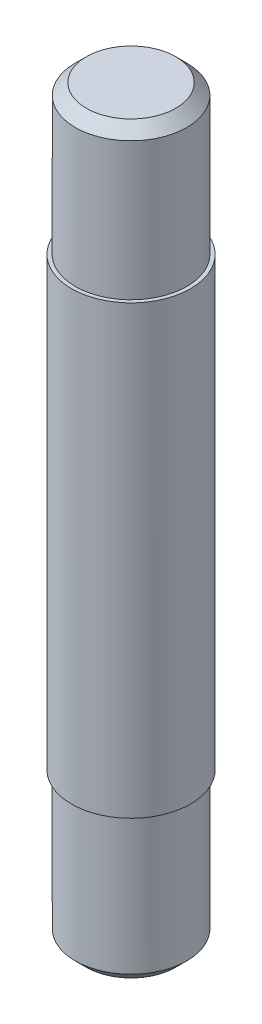
ISO-10303-21;
HEADER;
FILE_DESCRIPTION(('STEP AP214'),'2;1');
FILE_NAME('part.step','',(''),(''),'','','');
FILE_SCHEMA(('AUTOMOTIVE_DESIGN { 1 0 10303 214 1 1 1 1 }'));
ENDSEC;
DATA;
#1=APPLICATION_CONTEXT('core data for automotive mechanical design processes');
#2=APPLICATION_PROTOCOL_DEFINITION('international standard','automotive_design',2000,#1);
#3=PRODUCT_CONTEXT('',#1,'mechanical');
#4=PRODUCT('Part','Part','',(#3));
#5=PRODUCT_RELATED_PRODUCT_CATEGORY('part','',(#4));
#6=PRODUCT_DEFINITION_FORMATION('','',#4);
#7=PRODUCT_DEFINITION_CONTEXT('part definition',#1,'design');
#8=PRODUCT_DEFINITION('design','',#6,#7);
#9=PRODUCT_DEFINITION_SHAPE('','',#8);
#10=(LENGTH_UNIT() NAMED_UNIT(*) SI_UNIT(.MILLI.,.METRE.));
#11=(NAMED_UNIT(*) PLANE_ANGLE_UNIT() SI_UNIT($,.RADIAN.));
#12=(NAMED_UNIT(*) SI_UNIT($,.STERADIAN.) SOLID_ANGLE_UNIT());
#13=UNCERTAINTY_MEASURE_WITH_UNIT(LENGTH_MEASURE(1.E-05),#10,'distance_accuracy_value','');
#14=(GEOMETRIC_REPRESENTATION_CONTEXT(3) GLOBAL_UNCERTAINTY_ASSIGNED_CONTEXT((#13)) GLOBAL_UNIT_ASSIGNED_CONTEXT((#10,
#11,#12)) REPRESENTATION_CONTEXT('',''));
#15=CARTESIAN_POINT('',(0.,0.,0.));
#16=DIRECTION('',(0.,0.,1.));
#17=DIRECTION('',(1.,0.,0.));
#18=AXIS2_PLACEMENT_3D('',#15,#16,#17);
#19=CARTESIAN_POINT('',(0.,63.5,0.));
#20=DIRECTION('',(0.,-1.,0.));
#21=DIRECTION('',(0.,0.,-1.));
#22=AXIS2_PLACEMENT_3D('',#19,#20,#21);
#23=CYLINDRICAL_SURFACE('',#22,5.08);
#24=CARTESIAN_POINT('',(0.,50.8,0.));
#25=DIRECTION('',(0.,1.,0.));
#26=DIRECTION('',(0.,0.,1.));
#27=AXIS2_PLACEMENT_3D('',#24,#25,#26);
#28=CIRCLE('',#27,5.08);
#29=CARTESIAN_POINT('',(0.,50.8,5.08));
#30=VERTEX_POINT('',#29);
#31=EDGE_CURVE('E64',#30,#30,#28,.T.);
#32=ORIENTED_EDGE('',*,*,#31,.F.);
#33=EDGE_LOOP('',(#32));
#34=FACE_BOUND('',#33,.T.);
#35=CARTESIAN_POINT('',(0.,12.7,0.));
#36=DIRECTION('',(0.,-1.,0.));
#37=DIRECTION('',(0.,0.,-1.));
#38=AXIS2_PLACEMENT_3D('',#35,#36,#37);
#39=CIRCLE('',#38,5.08);
#40=CARTESIAN_POINT('',(0.,12.7,-5.08));
#41=VERTEX_POINT('',#40);
#42=EDGE_CURVE('E78',#41,#41,#39,.T.);
#43=ORIENTED_EDGE('',*,*,#42,.F.);
#44=EDGE_LOOP('',(#43));
#45=FACE_BOUND('',#44,.T.);
#46=ADVANCED_FACE('F47',(#34,#45),#23,.T.);
#47=CARTESIAN_POINT('',(0.,50.8,0.));
#48=DIRECTION('',(0.,1.,0.));
#49=DIRECTION('',(0.,0.,1.));
#50=AXIS2_PLACEMENT_3D('',#47,#48,#49);
#51=CYLINDRICAL_SURFACE('',#50,4.7625);
#52=CARTESIAN_POINT('',(0.,50.8,0.));
#53=DIRECTION('',(0.,1.,0.));
#54=DIRECTION('',(0.,0.,1.));
#55=AXIS2_PLACEMENT_3D('',#52,#53,#54);
#56=CIRCLE('',#55,4.7625);
#57=CARTESIAN_POINT('',(0.,50.8,4.7625));
#58=VERTEX_POINT('',#57);
#59=EDGE_CURVE('E70',#58,#58,#56,.T.);
#60=ORIENTED_EDGE('',*,*,#59,.T.);
#61=EDGE_LOOP('',(#60));
#62=FACE_BOUND('',#61,.T.);
#63=CARTESIAN_POINT('',(0.,62.55385,0.));
#64=DIRECTION('',(0.,-1.,0.));
#65=DIRECTION('',(0.,0.,-1.));
#66=AXIS2_PLACEMENT_3D('',#63,#64,#65);
#67=CIRCLE('',#66,4.7625);
#68=CARTESIAN_POINT('',(0.,62.55385,-4.7625));
#69=VERTEX_POINT('',#68);
#70=EDGE_CURVE('E59',#69,#69,#67,.T.);
#71=ORIENTED_EDGE('',*,*,#70,.T.);
#72=EDGE_LOOP('',(#71));
#73=FACE_BOUND('',#72,.T.);
#74=ADVANCED_FACE('F98',(#62,#73),#51,.T.);
#75=CARTESIAN_POINT('',(0.,50.8,0.));
#76=DIRECTION('',(0.,1.,0.));
#77=DIRECTION('',(0.,0.,1.));
#78=AXIS2_PLACEMENT_3D('',#75,#76,#77);
#79=PLANE('',#78);
#80=ORIENTED_EDGE('',*,*,#59,.F.);
#81=EDGE_LOOP('',(#80));
#82=FACE_BOUND('',#81,.T.);
#83=ORIENTED_EDGE('',*,*,#31,.T.);
#84=EDGE_LOOP('',(#83));
#85=FACE_BOUND('',#84,.T.);
#86=ADVANCED_FACE('F103',(#82,#85),#79,.T.);
#87=CARTESIAN_POINT('',(0.,63.5,0.));
#88=DIRECTION('',(0.,1.,0.));
#89=DIRECTION('',(0.,0.,1.));
#90=AXIS2_PLACEMENT_3D('',#87,#88,#89);
#91=PLANE('',#90);
#92=CARTESIAN_POINT('',(0.,63.5,0.));
#93=DIRECTION('',(0.,-1.,0.));
#94=DIRECTION('',(0.,0.,-1.));
#95=AXIS2_PLACEMENT_3D('',#92,#93,#94);
#96=CIRCLE('',#95,3.81635);
#97=CARTESIAN_POINT('',(0.,63.5,-3.81635));
#98=VERTEX_POINT('',#97);
#99=EDGE_CURVE('E10',#98,#98,#96,.T.);
#100=ORIENTED_EDGE('',*,*,#99,.F.);
#101=EDGE_LOOP('',(#100));
#102=FACE_BOUND('',#101,.T.);
#103=ADVANCED_FACE('F109',(#102),#91,.T.);
#104=CARTESIAN_POINT('',(0.,63.5,0.));
#105=DIRECTION('',(0.,-1.,0.));
#106=DIRECTION('',(0.,0.,-1.));
#107=AXIS2_PLACEMENT_3D('',#104,#105,#106);
#108=CONICAL_SURFACE('',#107,3.81635,0.785398163397461);
#109=ORIENTED_EDGE('',*,*,#70,.F.);
#110=EDGE_LOOP('',(#109));
#111=FACE_BOUND('',#110,.T.);
#112=ORIENTED_EDGE('',*,*,#99,.T.);
#113=EDGE_LOOP('',(#112));
#114=FACE_BOUND('',#113,.T.);
#115=ADVANCED_FACE('F115',(#111,#114),#108,.T.);
#116=CARTESIAN_POINT('',(0.,12.7,0.));
#117=DIRECTION('',(0.,-1.,0.));
#118=DIRECTION('',(0.,0.,-1.));
#119=AXIS2_PLACEMENT_3D('',#116,#117,#118);
#120=CYLINDRICAL_SURFACE('',#119,4.7625);
#121=CARTESIAN_POINT('',(0.,12.7,0.));
#122=DIRECTION('',(0.,-1.,0.));
#123=DIRECTION('',(0.,0.,-1.));
#124=AXIS2_PLACEMENT_3D('',#121,#122,#123);
#125=CIRCLE('',#124,4.7625);
#126=CARTESIAN_POINT('',(0.,12.7,-4.7625));
#127=VERTEX_POINT('',#126);
#128=EDGE_CURVE('E82',#127,#127,#125,.T.);
#129=ORIENTED_EDGE('',*,*,#128,.T.);
#130=EDGE_LOOP('',(#129));
#131=FACE_BOUND('',#130,.T.);
#132=CARTESIAN_POINT('',(0.,0.946149999999986,0.));
#133=DIRECTION('',(0.,1.,0.));
#134=DIRECTION('',(0.,0.,1.));
#135=AXIS2_PLACEMENT_3D('',#132,#133,#134);
#136=CIRCLE('',#135,4.7625);
#137=CARTESIAN_POINT('',(0.,0.946149999999986,4.7625));
#138=VERTEX_POINT('',#137);
#139=EDGE_CURVE('E74',#138,#138,#136,.T.);
#140=ORIENTED_EDGE('',*,*,#139,.T.);
#141=EDGE_LOOP('',(#140));
#142=FACE_BOUND('',#141,.T.);
#143=ADVANCED_FACE('F87',(#131,#142),#120,.T.);
#144=CARTESIAN_POINT('',(0.,12.7,0.));
#145=DIRECTION('',(0.,-1.,0.));
#146=DIRECTION('',(0.,0.,-1.));
#147=AXIS2_PLACEMENT_3D('',#144,#145,#146);
#148=PLANE('',#147);
#149=ORIENTED_EDGE('',*,*,#128,.F.);
#150=EDGE_LOOP('',(#149));
#151=FACE_BOUND('',#150,.T.);
#152=ORIENTED_EDGE('',*,*,#42,.T.);
#153=EDGE_LOOP('',(#152));
#154=FACE_BOUND('',#153,.T.);
#155=ADVANCED_FACE('F90',(#151,#154),#148,.T.);
#156=CARTESIAN_POINT('',(0.,0.,0.));
#157=DIRECTION('',(0.,1.,0.));
#158=DIRECTION('',(0.,0.,1.));
#159=AXIS2_PLACEMENT_3D('',#156,#157,#158);
#160=PLANE('',#159);
#161=CARTESIAN_POINT('',(0.,0.,0.));
#162=DIRECTION('',(0.,1.,0.));
#163=DIRECTION('',(0.,0.,1.));
#164=AXIS2_PLACEMENT_3D('',#161,#162,#163);
#165=CIRCLE('',#164,3.81635);
#166=CARTESIAN_POINT('',(0.,0.,3.81635));
#167=VERTEX_POINT('',#166);
#168=EDGE_CURVE('E54',#167,#167,#165,.T.);
#169=ORIENTED_EDGE('',*,*,#168,.F.);
#170=EDGE_LOOP('',(#169));
#171=FACE_BOUND('',#170,.T.);
#172=ADVANCED_FACE('F93',(#171),#160,.F.);
#173=CARTESIAN_POINT('',(0.,0.,0.));
#174=DIRECTION('',(0.,1.,0.));
#175=DIRECTION('',(0.,0.,1.));
#176=AXIS2_PLACEMENT_3D('',#173,#174,#175);
#177=CONICAL_SURFACE('',#176,3.81635,0.785398163397457);
#178=ORIENTED_EDGE('',*,*,#139,.F.);
#179=EDGE_LOOP('',(#178));
#180=FACE_BOUND('',#179,.T.);
#181=ORIENTED_EDGE('',*,*,#168,.T.);
#182=EDGE_LOOP('',(#181));
#183=FACE_BOUND('',#182,.T.);
#184=ADVANCED_FACE('F120',(#180,#183),#177,.T.);
#185=CLOSED_SHELL('',(#46,#74,#86,#103,#115,#143,#155,#172,#184));
#186=MANIFOLD_SOLID_BREP('B2',#185);
#187=ADVANCED_BREP_SHAPE_REPRESENTATION('',(#18,#186),#14);
#188=SHAPE_DEFINITION_REPRESENTATION(#9,#187);
ENDSEC;
END-ISO-10303-21;
